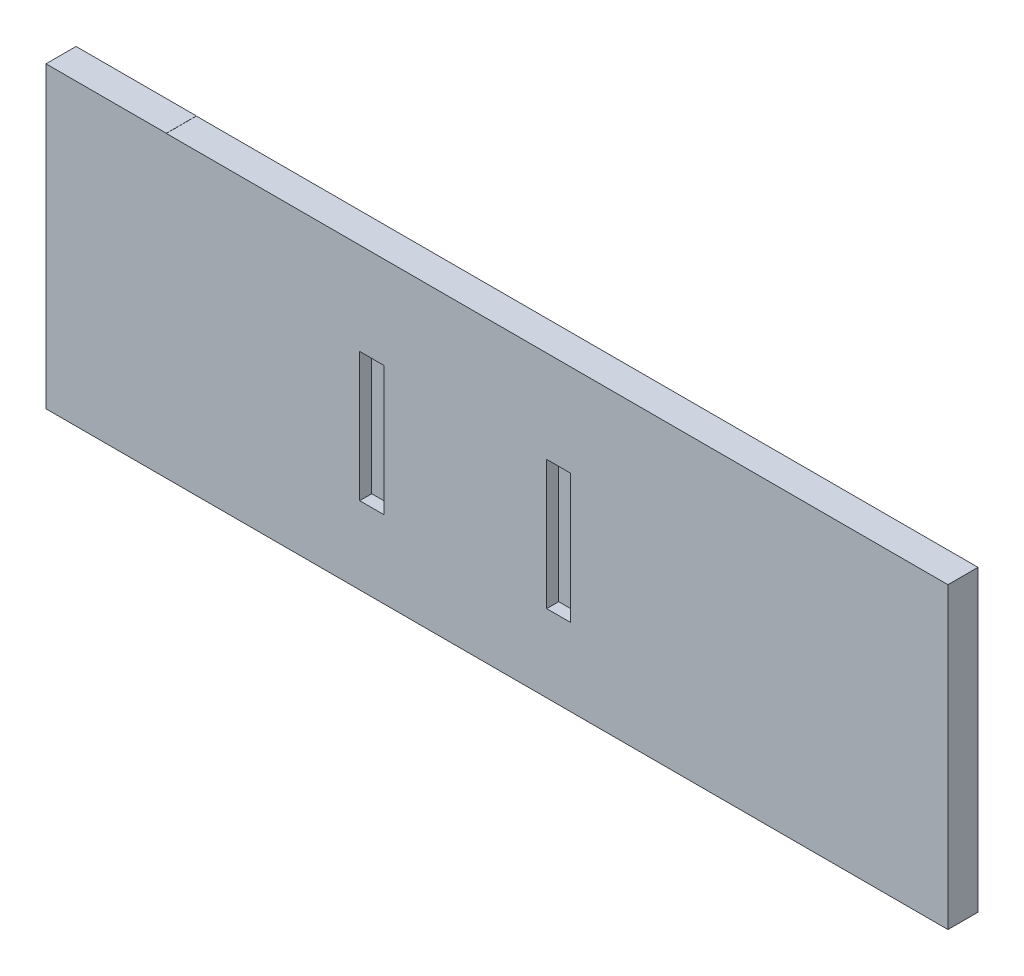
ISO-10303-21;
HEADER;
FILE_DESCRIPTION(('STEP AP214'),'2;1');
FILE_NAME('part.step','',(''),(''),'','','');
FILE_SCHEMA(('AUTOMOTIVE_DESIGN { 1 0 10303 214 1 1 1 1 }'));
ENDSEC;
DATA;
#1=APPLICATION_CONTEXT('core data for automotive mechanical design processes');
#2=APPLICATION_PROTOCOL_DEFINITION('international standard','automotive_design',2000,#1);
#3=PRODUCT_CONTEXT('',#1,'mechanical');
#4=PRODUCT('Part','Part','',(#3));
#5=PRODUCT_RELATED_PRODUCT_CATEGORY('part','',(#4));
#6=PRODUCT_DEFINITION_FORMATION('','',#4);
#7=PRODUCT_DEFINITION_CONTEXT('part definition',#1,'design');
#8=PRODUCT_DEFINITION('design','',#6,#7);
#9=PRODUCT_DEFINITION_SHAPE('','',#8);
#10=(LENGTH_UNIT() NAMED_UNIT(*) SI_UNIT(.MILLI.,.METRE.));
#11=(NAMED_UNIT(*) PLANE_ANGLE_UNIT() SI_UNIT($,.RADIAN.));
#12=(NAMED_UNIT(*) SI_UNIT($,.STERADIAN.) SOLID_ANGLE_UNIT());
#13=UNCERTAINTY_MEASURE_WITH_UNIT(LENGTH_MEASURE(1.E-05),#10,'distance_accuracy_value','');
#14=(GEOMETRIC_REPRESENTATION_CONTEXT(3) GLOBAL_UNCERTAINTY_ASSIGNED_CONTEXT((#13)) GLOBAL_UNIT_ASSIGNED_CONTEXT((#10,
#11,#12)) REPRESENTATION_CONTEXT('',''));
#15=CARTESIAN_POINT('',(0.,0.,0.));
#16=DIRECTION('',(0.,0.,1.));
#17=DIRECTION('',(1.,0.,0.));
#18=AXIS2_PLACEMENT_3D('',#15,#16,#17);
#19=CARTESIAN_POINT('',(0.,0.,50.));
#20=DIRECTION('',(0.,0.,-1.));
#21=DIRECTION('',(-1.,0.,0.));
#22=AXIS2_PLACEMENT_3D('',#19,#20,#21);
#23=PLANE('',#22);
#24=DIRECTION('',(1.,0.,0.));
#25=VECTOR('',#24,1.);
#26=CARTESIAN_POINT('',(0.,128.566812887664,50.));
#27=LINE('',#26,#25);
#28=CARTESIAN_POINT('',(-667.389420710901,128.566812887664,50.));
#29=VERTEX_POINT('',#28);
#30=CARTESIAN_POINT('',(-627.3894207109,128.566812887664,50.));
#31=VERTEX_POINT('',#30);
#32=EDGE_CURVE('E281',#29,#31,#27,.T.);
#33=ORIENTED_EDGE('',*,*,#32,.F.);
#34=DIRECTION('',(0.,-1.,0.));
#35=VECTOR('',#34,1.);
#36=CARTESIAN_POINT('',(-667.389420710901,0.,50.));
#37=LINE('',#36,#35);
#38=CARTESIAN_POINT('',(-667.389420710901,343.566812887664,50.));
#39=VERTEX_POINT('',#38);
#40=EDGE_CURVE('E278',#39,#29,#37,.T.);
#41=ORIENTED_EDGE('',*,*,#40,.F.);
#42=DIRECTION('',(-1.,0.,0.));
#43=VECTOR('',#42,1.);
#44=CARTESIAN_POINT('',(0.,343.566812887664,50.));
#45=LINE('',#44,#43);
#46=CARTESIAN_POINT('',(-627.3894207109,343.566812887664,50.));
#47=VERTEX_POINT('',#46);
#48=EDGE_CURVE('E275',#47,#39,#45,.T.);
#49=ORIENTED_EDGE('',*,*,#48,.F.);
#50=DIRECTION('',(0.,1.,0.));
#51=VECTOR('',#50,1.);
#52=CARTESIAN_POINT('',(-627.3894207109,0.,50.));
#53=LINE('',#52,#51);
#54=EDGE_CURVE('E272',#31,#47,#53,.T.);
#55=ORIENTED_EDGE('',*,*,#54,.F.);
#56=EDGE_LOOP('',(#33,#41,#49,#55));
#57=FACE_BOUND('',#56,.T.);
#58=DIRECTION('',(1.,0.,0.));
#59=VECTOR('',#58,1.);
#60=CARTESIAN_POINT('',(0.,0.,50.));
#61=LINE('',#60,#59);
#62=CARTESIAN_POINT('',(-1500.09890069013,-1.83709131713463E-13,50.));
#63=VERTEX_POINT('',#62);
#64=CARTESIAN_POINT('',(0.,0.,50.));
#65=VERTEX_POINT('',#64);
#66=EDGE_CURVE('E244',#63,#65,#61,.T.);
#67=ORIENTED_EDGE('',*,*,#66,.T.);
#68=DIRECTION('',(0.,1.,0.));
#69=VECTOR('',#68,1.);
#70=CARTESIAN_POINT('',(0.,496.747706101618,50.));
#71=LINE('',#70,#69);
#72=CARTESIAN_POINT('',(0.,496.747706101618,50.));
#73=VERTEX_POINT('',#72);
#74=EDGE_CURVE('E247',#65,#73,#71,.T.);
#75=ORIENTED_EDGE('',*,*,#74,.T.);
#76=DIRECTION('',(-1.,0.,0.));
#77=VECTOR('',#76,1.);
#78=CARTESIAN_POINT('',(-1300.,496.747706101618,50.));
#79=LINE('',#78,#77);
#80=CARTESIAN_POINT('',(-1300.,496.747706101618,50.));
#81=VERTEX_POINT('',#80);
#82=EDGE_CURVE('E147',#73,#81,#79,.T.);
#83=ORIENTED_EDGE('',*,*,#82,.T.);
#84=DIRECTION('',(0.,-1.,0.));
#85=VECTOR('',#84,1.);
#86=CARTESIAN_POINT('',(-1300.,497.,50.));
#87=LINE('',#86,#85);
#88=CARTESIAN_POINT('',(-1300.,497.,50.));
#89=VERTEX_POINT('',#88);
#90=EDGE_CURVE('E140',#89,#81,#87,.T.);
#91=ORIENTED_EDGE('',*,*,#90,.F.);
#92=DIRECTION('',(-1.,0.,0.));
#93=VECTOR('',#92,1.);
#94=CARTESIAN_POINT('',(-1500.09890069013,497.,50.));
#95=LINE('',#94,#93);
#96=CARTESIAN_POINT('',(-1500.09890069013,497.,50.));
#97=VERTEX_POINT('',#96);
#98=EDGE_CURVE('E145',#89,#97,#95,.T.);
#99=ORIENTED_EDGE('',*,*,#98,.T.);
#100=DIRECTION('',(0.,-1.,0.));
#101=VECTOR('',#100,1.);
#102=CARTESIAN_POINT('',(-1500.09890069013,497.,50.));
#103=LINE('',#102,#101);
#104=EDGE_CURVE('E153',#97,#63,#103,.T.);
#105=ORIENTED_EDGE('',*,*,#104,.T.);
#106=EDGE_LOOP('',(#67,#75,#83,#91,#99,#105));
#107=FACE_BOUND('',#106,.T.);
#108=DIRECTION('',(1.,0.,0.));
#109=VECTOR('',#108,1.);
#110=CARTESIAN_POINT('',(0.,128.566812887664,50.));
#111=LINE('',#110,#109);
#112=CARTESIAN_POINT('',(-978.316280033341,128.566812887664,50.));
#113=VERTEX_POINT('',#112);
#114=CARTESIAN_POINT('',(-938.316280033341,128.566812887664,50.));
#115=VERTEX_POINT('',#114);
#116=EDGE_CURVE('E11',#113,#115,#111,.T.);
#117=ORIENTED_EDGE('',*,*,#116,.F.);
#118=DIRECTION('',(0.,-1.,0.));
#119=VECTOR('',#118,1.);
#120=CARTESIAN_POINT('',(-978.316280033341,0.,50.));
#121=LINE('',#120,#119);
#122=CARTESIAN_POINT('',(-978.316280033341,343.566812887664,50.));
#123=VERTEX_POINT('',#122);
#124=EDGE_CURVE('E48',#123,#113,#121,.T.);
#125=ORIENTED_EDGE('',*,*,#124,.F.);
#126=DIRECTION('',(-1.,0.,0.));
#127=VECTOR('',#126,1.);
#128=CARTESIAN_POINT('',(0.,343.566812887664,50.));
#129=LINE('',#128,#127);
#130=CARTESIAN_POINT('',(-938.316280033341,343.566812887664,50.));
#131=VERTEX_POINT('',#130);
#132=EDGE_CURVE('E287',#131,#123,#129,.T.);
#133=ORIENTED_EDGE('',*,*,#132,.F.);
#134=DIRECTION('',(0.,1.,0.));
#135=VECTOR('',#134,1.);
#136=CARTESIAN_POINT('',(-938.316280033341,0.,50.));
#137=LINE('',#136,#135);
#138=EDGE_CURVE('E284',#115,#131,#137,.T.);
#139=ORIENTED_EDGE('',*,*,#138,.F.);
#140=EDGE_LOOP('',(#117,#125,#133,#139));
#141=FACE_BOUND('',#140,.T.);
#142=ADVANCED_FACE('F39',(#57,#107,#141),#23,.F.);
#143=CARTESIAN_POINT('',(0.,0.,50.));
#144=DIRECTION('',(0.,1.,0.));
#145=DIRECTION('',(-1.,0.,0.));
#146=AXIS2_PLACEMENT_3D('',#143,#144,#145);
#147=PLANE('',#146);
#148=DIRECTION('',(1.,0.,0.));
#149=VECTOR('',#148,1.);
#150=CARTESIAN_POINT('',(0.,0.,0.));
#151=LINE('',#150,#149);
#152=CARTESIAN_POINT('',(-1500.09890069013,-1.83709131713463E-13,0.));
#153=VERTEX_POINT('',#152);
#154=CARTESIAN_POINT('',(0.,0.,0.));
#155=VERTEX_POINT('',#154);
#156=EDGE_CURVE('E218',#153,#155,#151,.T.);
#157=ORIENTED_EDGE('',*,*,#156,.T.);
#158=DIRECTION('',(0.,0.,-1.));
#159=VECTOR('',#158,1.);
#160=CARTESIAN_POINT('',(0.,0.,50.));
#161=LINE('',#160,#159);
#162=EDGE_CURVE('E268',#65,#155,#161,.T.);
#163=ORIENTED_EDGE('',*,*,#162,.F.);
#164=ORIENTED_EDGE('',*,*,#66,.F.);
#165=DIRECTION('',(0.,0.,-1.));
#166=VECTOR('',#165,1.);
#167=CARTESIAN_POINT('',(-1500.09890069013,-1.83709131713463E-13,0.));
#168=LINE('',#167,#166);
#169=EDGE_CURVE('E171',#63,#153,#168,.T.);
#170=ORIENTED_EDGE('',*,*,#169,.T.);
#171=EDGE_LOOP('',(#157,#163,#164,#170));
#172=FACE_BOUND('',#171,.T.);
#173=ADVANCED_FACE('F41',(#172),#147,.F.);
#174=CARTESIAN_POINT('',(0.,496.747706101618,50.));
#175=DIRECTION('',(-1.,0.,0.));
#176=DIRECTION('',(0.,0.,1.));
#177=AXIS2_PLACEMENT_3D('',#174,#175,#176);
#178=PLANE('',#177);
#179=DIRECTION('',(0.,1.,0.));
#180=VECTOR('',#179,1.);
#181=CARTESIAN_POINT('',(0.,496.747706101618,0.));
#182=LINE('',#181,#180);
#183=CARTESIAN_POINT('',(0.,496.747706101618,0.));
#184=VERTEX_POINT('',#183);
#185=EDGE_CURVE('E257',#155,#184,#182,.T.);
#186=ORIENTED_EDGE('',*,*,#185,.T.);
#187=DIRECTION('',(0.,0.,-1.));
#188=VECTOR('',#187,1.);
#189=CARTESIAN_POINT('',(0.,496.747706101618,50.));
#190=LINE('',#189,#188);
#191=EDGE_CURVE('E264',#73,#184,#190,.T.);
#192=ORIENTED_EDGE('',*,*,#191,.F.);
#193=ORIENTED_EDGE('',*,*,#74,.F.);
#194=ORIENTED_EDGE('',*,*,#162,.T.);
#195=EDGE_LOOP('',(#186,#192,#193,#194));
#196=FACE_BOUND('',#195,.T.);
#197=ADVANCED_FACE('F324',(#196),#178,.F.);
#198=CARTESIAN_POINT('',(-1300.,496.747706101618,50.));
#199=DIRECTION('',(0.,-1.,0.));
#200=DIRECTION('',(0.,0.,-1.));
#201=AXIS2_PLACEMENT_3D('',#198,#199,#200);
#202=PLANE('',#201);
#203=DIRECTION('',(-1.,0.,0.));
#204=VECTOR('',#203,1.);
#205=CARTESIAN_POINT('',(-1300.,496.747706101618,0.));
#206=LINE('',#205,#204);
#207=CARTESIAN_POINT('',(-1300.,496.747706101618,0.));
#208=VERTEX_POINT('',#207);
#209=EDGE_CURVE('E248',#184,#208,#206,.T.);
#210=ORIENTED_EDGE('',*,*,#209,.T.);
#211=DIRECTION('',(0.,0.,-1.));
#212=VECTOR('',#211,1.);
#213=CARTESIAN_POINT('',(-1300.,496.747706101618,50.));
#214=LINE('',#213,#212);
#215=EDGE_CURVE('E253',#81,#208,#214,.T.);
#216=ORIENTED_EDGE('',*,*,#215,.F.);
#217=ORIENTED_EDGE('',*,*,#82,.F.);
#218=ORIENTED_EDGE('',*,*,#191,.T.);
#219=EDGE_LOOP('',(#210,#216,#217,#218));
#220=FACE_BOUND('',#219,.T.);
#221=ADVANCED_FACE('F335',(#220),#202,.F.);
#222=CARTESIAN_POINT('',(0.,0.,0.));
#223=DIRECTION('',(0.,0.,-1.));
#224=DIRECTION('',(-1.,0.,0.));
#225=AXIS2_PLACEMENT_3D('',#222,#223,#224);
#226=PLANE('',#225);
#227=ORIENTED_EDGE('',*,*,#156,.F.);
#228=DIRECTION('',(0.,-1.,0.));
#229=VECTOR('',#228,1.);
#230=CARTESIAN_POINT('',(-1500.09890069013,497.,0.));
#231=LINE('',#230,#229);
#232=CARTESIAN_POINT('',(-1500.09890069013,497.,0.));
#233=VERTEX_POINT('',#232);
#234=EDGE_CURVE('E184',#233,#153,#231,.T.);
#235=ORIENTED_EDGE('',*,*,#234,.F.);
#236=DIRECTION('',(1.,0.,0.));
#237=VECTOR('',#236,1.);
#238=CARTESIAN_POINT('',(-1300.,497.,0.));
#239=LINE('',#238,#237);
#240=CARTESIAN_POINT('',(-1300.,497.,0.));
#241=VERTEX_POINT('',#240);
#242=EDGE_CURVE('E154',#233,#241,#239,.T.);
#243=ORIENTED_EDGE('',*,*,#242,.T.);
#244=DIRECTION('',(0.,-1.,0.));
#245=VECTOR('',#244,1.);
#246=CARTESIAN_POINT('',(-1300.,497.,0.));
#247=LINE('',#246,#245);
#248=EDGE_CURVE('E169',#241,#208,#247,.T.);
#249=ORIENTED_EDGE('',*,*,#248,.T.);
#250=ORIENTED_EDGE('',*,*,#209,.F.);
#251=ORIENTED_EDGE('',*,*,#185,.F.);
#252=EDGE_LOOP('',(#227,#235,#243,#249,#250,#251));
#253=FACE_BOUND('',#252,.T.);
#254=ADVANCED_FACE('F331',(#253),#226,.T.);
#255=CARTESIAN_POINT('',(-627.3894207109,128.566812887664,30.));
#256=DIRECTION('',(0.,1.,0.));
#257=DIRECTION('',(0.,0.,1.));
#258=AXIS2_PLACEMENT_3D('',#255,#256,#257);
#259=PLANE('',#258);
#260=ORIENTED_EDGE('',*,*,#32,.T.);
#261=DIRECTION('',(0.,0.,1.));
#262=VECTOR('',#261,1.);
#263=CARTESIAN_POINT('',(-627.3894207109,128.566812887664,30.));
#264=LINE('',#263,#262);
#265=CARTESIAN_POINT('',(-627.3894207109,128.566812887664,30.));
#266=VERTEX_POINT('',#265);
#267=EDGE_CURVE('E62',#266,#31,#264,.T.);
#268=ORIENTED_EDGE('',*,*,#267,.F.);
#269=DIRECTION('',(-1.,0.,0.));
#270=VECTOR('',#269,1.);
#271=CARTESIAN_POINT('',(-627.3894207109,128.566812887664,30.));
#272=LINE('',#271,#270);
#273=CARTESIAN_POINT('',(-667.389420710901,128.566812887664,30.));
#274=VERTEX_POINT('',#273);
#275=EDGE_CURVE('E195',#266,#274,#272,.T.);
#276=ORIENTED_EDGE('',*,*,#275,.T.);
#277=DIRECTION('',(0.,0.,1.));
#278=VECTOR('',#277,1.);
#279=CARTESIAN_POINT('',(-667.389420710901,128.566812887664,30.));
#280=LINE('',#279,#278);
#281=EDGE_CURVE('E183',#274,#29,#280,.T.);
#282=ORIENTED_EDGE('',*,*,#281,.T.);
#283=EDGE_LOOP('',(#260,#268,#276,#282));
#284=FACE_BOUND('',#283,.T.);
#285=ADVANCED_FACE('F334',(#284),#259,.T.);
#286=CARTESIAN_POINT('',(-667.389420710901,248.373853050809,30.));
#287=DIRECTION('',(1.,0.,0.));
#288=DIRECTION('',(0.,0.,-1.));
#289=AXIS2_PLACEMENT_3D('',#286,#287,#288);
#290=PLANE('',#289);
#291=ORIENTED_EDGE('',*,*,#40,.T.);
#292=ORIENTED_EDGE('',*,*,#281,.F.);
#293=DIRECTION('',(0.,1.,0.));
#294=VECTOR('',#293,1.);
#295=CARTESIAN_POINT('',(-667.389420710901,128.566812887664,30.));
#296=LINE('',#295,#294);
#297=CARTESIAN_POINT('',(-667.389420710901,343.566812887664,30.));
#298=VERTEX_POINT('',#297);
#299=EDGE_CURVE('E238',#274,#298,#296,.T.);
#300=ORIENTED_EDGE('',*,*,#299,.T.);
#301=DIRECTION('',(0.,0.,1.));
#302=VECTOR('',#301,1.);
#303=CARTESIAN_POINT('',(-667.389420710901,343.566812887664,30.));
#304=LINE('',#303,#302);
#305=EDGE_CURVE('E222',#298,#39,#304,.T.);
#306=ORIENTED_EDGE('',*,*,#305,.T.);
#307=EDGE_LOOP('',(#291,#292,#300,#306));
#308=FACE_BOUND('',#307,.T.);
#309=ADVANCED_FACE('F451',(#308),#290,.T.);
#310=CARTESIAN_POINT('',(-667.389420710901,343.566812887664,30.));
#311=DIRECTION('',(0.,-1.,0.));
#312=DIRECTION('',(0.,0.,-1.));
#313=AXIS2_PLACEMENT_3D('',#310,#311,#312);
#314=PLANE('',#313);
#315=ORIENTED_EDGE('',*,*,#48,.T.);
#316=ORIENTED_EDGE('',*,*,#305,.F.);
#317=DIRECTION('',(1.,0.,0.));
#318=VECTOR('',#317,1.);
#319=CARTESIAN_POINT('',(-667.389420710901,343.566812887664,30.));
#320=LINE('',#319,#318);
#321=CARTESIAN_POINT('',(-627.3894207109,343.566812887664,30.));
#322=VERTEX_POINT('',#321);
#323=EDGE_CURVE('E235',#298,#322,#320,.T.);
#324=ORIENTED_EDGE('',*,*,#323,.T.);
#325=DIRECTION('',(0.,0.,1.));
#326=VECTOR('',#325,1.);
#327=CARTESIAN_POINT('',(-627.3894207109,343.566812887664,30.));
#328=LINE('',#327,#326);
#329=EDGE_CURVE('E226',#322,#47,#328,.T.);
#330=ORIENTED_EDGE('',*,*,#329,.T.);
#331=EDGE_LOOP('',(#315,#316,#324,#330));
#332=FACE_BOUND('',#331,.T.);
#333=ADVANCED_FACE('F443',(#332),#314,.T.);
#334=CARTESIAN_POINT('',(-627.3894207109,343.566812887664,30.));
#335=DIRECTION('',(-1.,0.,0.));
#336=DIRECTION('',(0.,0.,1.));
#337=AXIS2_PLACEMENT_3D('',#334,#335,#336);
#338=PLANE('',#337);
#339=ORIENTED_EDGE('',*,*,#54,.T.);
#340=ORIENTED_EDGE('',*,*,#329,.F.);
#341=DIRECTION('',(0.,-1.,0.));
#342=VECTOR('',#341,1.);
#343=CARTESIAN_POINT('',(-627.3894207109,343.566812887664,30.));
#344=LINE('',#343,#342);
#345=EDGE_CURVE('E232',#322,#266,#344,.T.);
#346=ORIENTED_EDGE('',*,*,#345,.T.);
#347=ORIENTED_EDGE('',*,*,#267,.T.);
#348=EDGE_LOOP('',(#339,#340,#346,#347));
#349=FACE_BOUND('',#348,.T.);
#350=ADVANCED_FACE('F434',(#349),#338,.T.);
#351=CARTESIAN_POINT('',(0.,0.,30.));
#352=DIRECTION('',(0.,0.,-1.));
#353=DIRECTION('',(-1.,0.,0.));
#354=AXIS2_PLACEMENT_3D('',#351,#352,#353);
#355=PLANE('',#354);
#356=ORIENTED_EDGE('',*,*,#275,.F.);
#357=ORIENTED_EDGE('',*,*,#345,.F.);
#358=ORIENTED_EDGE('',*,*,#323,.F.);
#359=ORIENTED_EDGE('',*,*,#299,.F.);
#360=EDGE_LOOP('',(#356,#357,#358,#359));
#361=FACE_BOUND('',#360,.T.);
#362=ADVANCED_FACE('F329',(#361),#355,.F.);
#363=CARTESIAN_POINT('',(-938.316280033341,128.566812887664,30.));
#364=DIRECTION('',(0.,1.,0.));
#365=DIRECTION('',(0.,0.,1.));
#366=AXIS2_PLACEMENT_3D('',#363,#364,#365);
#367=PLANE('',#366);
#368=ORIENTED_EDGE('',*,*,#116,.T.);
#369=DIRECTION('',(0.,0.,1.));
#370=VECTOR('',#369,1.);
#371=CARTESIAN_POINT('',(-938.316280033341,128.566812887664,30.));
#372=LINE('',#371,#370);
#373=CARTESIAN_POINT('',(-938.316280033341,128.566812887664,30.));
#374=VERTEX_POINT('',#373);
#375=EDGE_CURVE('E55',#374,#115,#372,.T.);
#376=ORIENTED_EDGE('',*,*,#375,.F.);
#377=DIRECTION('',(-1.,0.,0.));
#378=VECTOR('',#377,1.);
#379=CARTESIAN_POINT('',(-938.316280033341,128.566812887664,30.));
#380=LINE('',#379,#378);
#381=CARTESIAN_POINT('',(-978.316280033341,128.566812887664,30.));
#382=VERTEX_POINT('',#381);
#383=EDGE_CURVE('E190',#374,#382,#380,.T.);
#384=ORIENTED_EDGE('',*,*,#383,.T.);
#385=DIRECTION('',(0.,0.,1.));
#386=VECTOR('',#385,1.);
#387=CARTESIAN_POINT('',(-978.316280033341,128.566812887664,30.));
#388=LINE('',#387,#386);
#389=EDGE_CURVE('E214',#382,#113,#388,.T.);
#390=ORIENTED_EDGE('',*,*,#389,.T.);
#391=EDGE_LOOP('',(#368,#376,#384,#390));
#392=FACE_BOUND('',#391,.T.);
#393=ADVANCED_FACE('F298',(#392),#367,.T.);
#394=CARTESIAN_POINT('',(-978.316280033341,248.373853050809,30.));
#395=DIRECTION('',(1.,0.,0.));
#396=DIRECTION('',(0.,0.,-1.));
#397=AXIS2_PLACEMENT_3D('',#394,#395,#396);
#398=PLANE('',#397);
#399=ORIENTED_EDGE('',*,*,#124,.T.);
#400=ORIENTED_EDGE('',*,*,#389,.F.);
#401=DIRECTION('',(0.,1.,0.));
#402=VECTOR('',#401,1.);
#403=CARTESIAN_POINT('',(-978.316280033341,128.566812887664,30.));
#404=LINE('',#403,#402);
#405=CARTESIAN_POINT('',(-978.316280033341,343.566812887664,30.));
#406=VERTEX_POINT('',#405);
#407=EDGE_CURVE('E194',#382,#406,#404,.T.);
#408=ORIENTED_EDGE('',*,*,#407,.T.);
#409=DIRECTION('',(0.,0.,1.));
#410=VECTOR('',#409,1.);
#411=CARTESIAN_POINT('',(-978.316280033341,343.566812887664,30.));
#412=LINE('',#411,#410);
#413=EDGE_CURVE('E210',#406,#123,#412,.T.);
#414=ORIENTED_EDGE('',*,*,#413,.T.);
#415=EDGE_LOOP('',(#399,#400,#408,#414));
#416=FACE_BOUND('',#415,.T.);
#417=ADVANCED_FACE('F293',(#416),#398,.T.);
#418=CARTESIAN_POINT('',(-978.316280033341,343.566812887664,30.));
#419=DIRECTION('',(0.,-1.,0.));
#420=DIRECTION('',(0.,0.,-1.));
#421=AXIS2_PLACEMENT_3D('',#418,#419,#420);
#422=PLANE('',#421);
#423=ORIENTED_EDGE('',*,*,#132,.T.);
#424=ORIENTED_EDGE('',*,*,#413,.F.);
#425=DIRECTION('',(1.,0.,0.));
#426=VECTOR('',#425,1.);
#427=CARTESIAN_POINT('',(-978.316280033341,343.566812887664,30.));
#428=LINE('',#427,#426);
#429=CARTESIAN_POINT('',(-938.316280033341,343.566812887664,30.));
#430=VERTEX_POINT('',#429);
#431=EDGE_CURVE('E198',#406,#430,#428,.T.);
#432=ORIENTED_EDGE('',*,*,#431,.T.);
#433=DIRECTION('',(0.,0.,1.));
#434=VECTOR('',#433,1.);
#435=CARTESIAN_POINT('',(-938.316280033341,343.566812887664,30.));
#436=LINE('',#435,#434);
#437=EDGE_CURVE('E206',#430,#131,#436,.T.);
#438=ORIENTED_EDGE('',*,*,#437,.T.);
#439=EDGE_LOOP('',(#423,#424,#432,#438));
#440=FACE_BOUND('',#439,.T.);
#441=ADVANCED_FACE('F305',(#440),#422,.T.);
#442=CARTESIAN_POINT('',(-938.316280033341,343.566812887664,30.));
#443=DIRECTION('',(-1.,0.,0.));
#444=DIRECTION('',(0.,0.,1.));
#445=AXIS2_PLACEMENT_3D('',#442,#443,#444);
#446=PLANE('',#445);
#447=ORIENTED_EDGE('',*,*,#138,.T.);
#448=ORIENTED_EDGE('',*,*,#437,.F.);
#449=DIRECTION('',(0.,-1.,0.));
#450=VECTOR('',#449,1.);
#451=CARTESIAN_POINT('',(-938.316280033341,343.566812887664,30.));
#452=LINE('',#451,#450);
#453=EDGE_CURVE('E201',#430,#374,#452,.T.);
#454=ORIENTED_EDGE('',*,*,#453,.T.);
#455=ORIENTED_EDGE('',*,*,#375,.T.);
#456=EDGE_LOOP('',(#447,#448,#454,#455));
#457=FACE_BOUND('',#456,.T.);
#458=ADVANCED_FACE('F302',(#457),#446,.T.);
#459=CARTESIAN_POINT('',(0.,0.,30.));
#460=DIRECTION('',(0.,0.,-1.));
#461=DIRECTION('',(-1.,0.,0.));
#462=AXIS2_PLACEMENT_3D('',#459,#460,#461);
#463=PLANE('',#462);
#464=ORIENTED_EDGE('',*,*,#383,.F.);
#465=ORIENTED_EDGE('',*,*,#453,.F.);
#466=ORIENTED_EDGE('',*,*,#431,.F.);
#467=ORIENTED_EDGE('',*,*,#407,.F.);
#468=EDGE_LOOP('',(#464,#465,#466,#467));
#469=FACE_BOUND('',#468,.T.);
#470=ADVANCED_FACE('F308',(#469),#463,.F.);
#471=CARTESIAN_POINT('',(-1300.,497.,50.));
#472=DIRECTION('',(1.,0.,0.));
#473=DIRECTION('',(0.,1.,0.));
#474=AXIS2_PLACEMENT_3D('',#471,#472,#473);
#475=PLANE('',#474);
#476=ORIENTED_EDGE('',*,*,#90,.T.);
#477=ORIENTED_EDGE('',*,*,#215,.T.);
#478=ORIENTED_EDGE('',*,*,#248,.F.);
#479=DIRECTION('',(0.,0.,1.));
#480=VECTOR('',#479,1.);
#481=CARTESIAN_POINT('',(-1300.,497.,50.));
#482=LINE('',#481,#480);
#483=EDGE_CURVE('E161',#241,#89,#482,.T.);
#484=ORIENTED_EDGE('',*,*,#483,.T.);
#485=EDGE_LOOP('',(#476,#477,#478,#484));
#486=FACE_BOUND('',#485,.T.);
#487=ADVANCED_FACE('F167',(#486),#475,.T.);
#488=CARTESIAN_POINT('',(-1500.09890069013,497.,0.));
#489=DIRECTION('',(-1.,0.,0.));
#490=DIRECTION('',(0.,-1.,0.));
#491=AXIS2_PLACEMENT_3D('',#488,#489,#490);
#492=PLANE('',#491);
#493=ORIENTED_EDGE('',*,*,#169,.F.);
#494=ORIENTED_EDGE('',*,*,#104,.F.);
#495=DIRECTION('',(0.,0.,-1.));
#496=VECTOR('',#495,1.);
#497=CARTESIAN_POINT('',(-1500.09890069013,497.,0.));
#498=LINE('',#497,#496);
#499=EDGE_CURVE('E164',#97,#233,#498,.T.);
#500=ORIENTED_EDGE('',*,*,#499,.T.);
#501=ORIENTED_EDGE('',*,*,#234,.T.);
#502=EDGE_LOOP('',(#493,#494,#500,#501));
#503=FACE_BOUND('',#502,.T.);
#504=ADVANCED_FACE('F316',(#503),#492,.T.);
#505=CARTESIAN_POINT('',(0.,497.,0.));
#506=DIRECTION('',(0.,1.,0.));
#507=DIRECTION('',(-1.,0.,0.));
#508=AXIS2_PLACEMENT_3D('',#505,#506,#507);
#509=PLANE('',#508);
#510=ORIENTED_EDGE('',*,*,#483,.F.);
#511=ORIENTED_EDGE('',*,*,#242,.F.);
#512=ORIENTED_EDGE('',*,*,#499,.F.);
#513=ORIENTED_EDGE('',*,*,#98,.F.);
#514=EDGE_LOOP('',(#510,#511,#512,#513));
#515=FACE_BOUND('',#514,.T.);
#516=ADVANCED_FACE('F159',(#515),#509,.T.);
#517=CLOSED_SHELL('',(#142,#173,#197,#221,#254,#285,#309,#333,#350,#362,#393,#417,#441,#458,
#470,#487,#504,#516));
#518=MANIFOLD_SOLID_BREP('B2',#517);
#519=ADVANCED_BREP_SHAPE_REPRESENTATION('',(#18,#518),#14);
#520=SHAPE_DEFINITION_REPRESENTATION(#9,#519);
ENDSEC;
END-ISO-10303-21;
